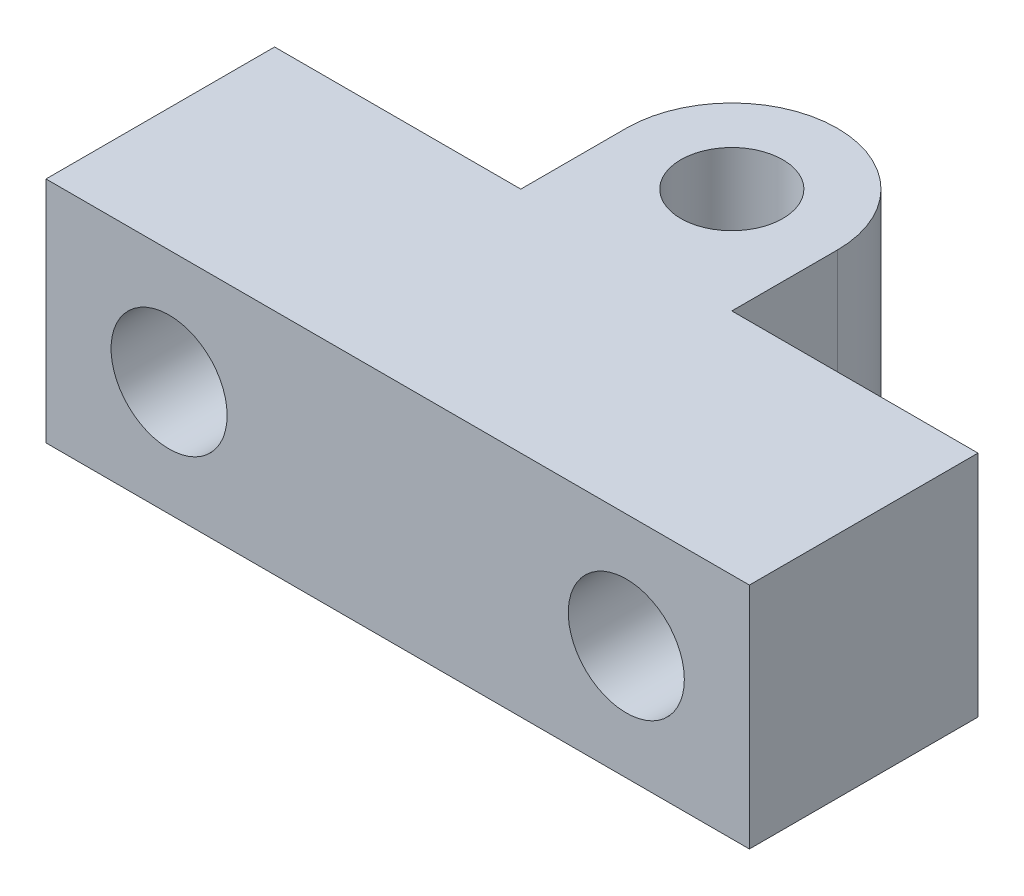
ISO-10303-21;
HEADER;
FILE_DESCRIPTION(('STEP AP214'),'2;1');
FILE_NAME('part.step','',(''),(''),'','','');
FILE_SCHEMA(('AUTOMOTIVE_DESIGN { 1 0 10303 214 1 1 1 1 }'));
ENDSEC;
DATA;
#1=APPLICATION_CONTEXT('core data for automotive mechanical design processes');
#2=APPLICATION_PROTOCOL_DEFINITION('international standard','automotive_design',2000,#1);
#3=PRODUCT_CONTEXT('',#1,'mechanical');
#4=PRODUCT('Part','Part','',(#3));
#5=PRODUCT_RELATED_PRODUCT_CATEGORY('part','',(#4));
#6=PRODUCT_DEFINITION_FORMATION('','',#4);
#7=PRODUCT_DEFINITION_CONTEXT('part definition',#1,'design');
#8=PRODUCT_DEFINITION('design','',#6,#7);
#9=PRODUCT_DEFINITION_SHAPE('','',#8);
#10=(LENGTH_UNIT() NAMED_UNIT(*) SI_UNIT(.MILLI.,.METRE.));
#11=(NAMED_UNIT(*) PLANE_ANGLE_UNIT() SI_UNIT($,.RADIAN.));
#12=(NAMED_UNIT(*) SI_UNIT($,.STERADIAN.) SOLID_ANGLE_UNIT());
#13=UNCERTAINTY_MEASURE_WITH_UNIT(LENGTH_MEASURE(1.E-05),#10,'distance_accuracy_value','');
#14=(GEOMETRIC_REPRESENTATION_CONTEXT(3) GLOBAL_UNCERTAINTY_ASSIGNED_CONTEXT((#13)) GLOBAL_UNIT_ASSIGNED_CONTEXT((#10,
#11,#12)) REPRESENTATION_CONTEXT('',''));
#15=CARTESIAN_POINT('',(0.,0.,0.));
#16=DIRECTION('',(0.,0.,1.));
#17=DIRECTION('',(1.,0.,0.));
#18=AXIS2_PLACEMENT_3D('',#15,#16,#17);
#19=CARTESIAN_POINT('',(0.,-3.25,0.));
#20=DIRECTION('',(0.,1.,0.));
#21=DIRECTION('',(1.,0.,0.));
#22=AXIS2_PLACEMENT_3D('',#19,#20,#21);
#23=PLANE('',#22);
#24=DIRECTION('',(-1.,0.,0.));
#25=VECTOR('',#24,1.);
#26=CARTESIAN_POINT('',(-3.,-3.25,3.));
#27=LINE('',#26,#25);
#28=CARTESIAN_POINT('',(-3.,-3.25,3.));
#29=VERTEX_POINT('',#28);
#30=CARTESIAN_POINT('',(-10.,-3.25,3.));
#31=VERTEX_POINT('',#30);
#32=EDGE_CURVE('E132',#29,#31,#27,.T.);
#33=ORIENTED_EDGE('',*,*,#32,.F.);
#34=DIRECTION('',(0.,0.,1.));
#35=VECTOR('',#34,1.);
#36=CARTESIAN_POINT('',(-3.,-3.25,0.));
#37=LINE('',#36,#35);
#38=CARTESIAN_POINT('',(-3.,-3.25,0.));
#39=VERTEX_POINT('',#38);
#40=EDGE_CURVE('E36',#39,#29,#37,.T.);
#41=ORIENTED_EDGE('',*,*,#40,.F.);
#42=CARTESIAN_POINT('',(0.,-3.25,0.));
#43=DIRECTION('',(0.,1.,0.));
#44=DIRECTION('',(1.,0.,0.));
#45=AXIS2_PLACEMENT_3D('',#42,#43,#44);
#46=CIRCLE('',#45,3.);
#47=CARTESIAN_POINT('',(3.,-3.25,0.));
#48=VERTEX_POINT('',#47);
#49=EDGE_CURVE('E146',#48,#39,#46,.T.);
#50=ORIENTED_EDGE('',*,*,#49,.F.);
#51=DIRECTION('',(0.,0.,-1.));
#52=VECTOR('',#51,1.);
#53=CARTESIAN_POINT('',(3.,-3.25,3.));
#54=LINE('',#53,#52);
#55=CARTESIAN_POINT('',(3.,-3.25,3.));
#56=VERTEX_POINT('',#55);
#57=EDGE_CURVE('E153',#56,#48,#54,.T.);
#58=ORIENTED_EDGE('',*,*,#57,.F.);
#59=DIRECTION('',(-1.,0.,0.));
#60=VECTOR('',#59,1.);
#61=CARTESIAN_POINT('',(10.,-3.25,3.));
#62=LINE('',#61,#60);
#63=CARTESIAN_POINT('',(10.,-3.25,3.));
#64=VERTEX_POINT('',#63);
#65=EDGE_CURVE('E158',#64,#56,#62,.T.);
#66=ORIENTED_EDGE('',*,*,#65,.F.);
#67=DIRECTION('',(0.,0.,-1.));
#68=VECTOR('',#67,1.);
#69=CARTESIAN_POINT('',(10.,-3.25,9.5));
#70=LINE('',#69,#68);
#71=CARTESIAN_POINT('',(10.,-3.25,9.5));
#72=VERTEX_POINT('',#71);
#73=EDGE_CURVE('E104',#72,#64,#70,.T.);
#74=ORIENTED_EDGE('',*,*,#73,.F.);
#75=DIRECTION('',(1.,0.,0.));
#76=VECTOR('',#75,1.);
#77=CARTESIAN_POINT('',(-10.,-3.25,9.5));
#78=LINE('',#77,#76);
#79=CARTESIAN_POINT('',(-10.,-3.25,9.5));
#80=VERTEX_POINT('',#79);
#81=EDGE_CURVE('E102',#80,#72,#78,.T.);
#82=ORIENTED_EDGE('',*,*,#81,.F.);
#83=DIRECTION('',(0.,0.,1.));
#84=VECTOR('',#83,1.);
#85=CARTESIAN_POINT('',(-10.,-3.25,3.));
#86=LINE('',#85,#84);
#87=EDGE_CURVE('E27',#31,#80,#86,.T.);
#88=ORIENTED_EDGE('',*,*,#87,.F.);
#89=EDGE_LOOP('',(#33,#41,#50,#58,#66,#74,#82,#88));
#90=FACE_BOUND('',#89,.T.);
#91=CARTESIAN_POINT('',(0.,-3.25,0.));
#92=DIRECTION('',(0.,-1.,0.));
#93=DIRECTION('',(-1.,0.,0.));
#94=AXIS2_PLACEMENT_3D('',#91,#92,#93);
#95=CIRCLE('',#94,1.45);
#96=CARTESIAN_POINT('',(-1.45,-3.25,0.));
#97=VERTEX_POINT('',#96);
#98=EDGE_CURVE('E124',#97,#97,#95,.T.);
#99=ORIENTED_EDGE('',*,*,#98,.F.);
#100=EDGE_LOOP('',(#99));
#101=FACE_BOUND('',#100,.T.);
#102=ADVANCED_FACE('F17',(#90,#101),#23,.F.);
#103=CARTESIAN_POINT('',(-10.,-3.25,3.));
#104=DIRECTION('',(-1.,0.,0.));
#105=DIRECTION('',(0.,0.,1.));
#106=AXIS2_PLACEMENT_3D('',#103,#104,#105);
#107=PLANE('',#106);
#108=DIRECTION('',(0.,1.,0.));
#109=VECTOR('',#108,1.);
#110=CARTESIAN_POINT('',(-10.,-3.25,9.5));
#111=LINE('',#110,#109);
#112=CARTESIAN_POINT('',(-10.,3.25,9.5));
#113=VERTEX_POINT('',#112);
#114=EDGE_CURVE('E11',#80,#113,#111,.T.);
#115=ORIENTED_EDGE('',*,*,#114,.T.);
#116=DIRECTION('',(0.,0.,1.));
#117=VECTOR('',#116,1.);
#118=CARTESIAN_POINT('',(-10.,3.25,3.));
#119=LINE('',#118,#117);
#120=CARTESIAN_POINT('',(-10.,3.25,3.));
#121=VERTEX_POINT('',#120);
#122=EDGE_CURVE('E109',#121,#113,#119,.T.);
#123=ORIENTED_EDGE('',*,*,#122,.F.);
#124=DIRECTION('',(0.,1.,0.));
#125=VECTOR('',#124,1.);
#126=CARTESIAN_POINT('',(-10.,-3.25,3.));
#127=LINE('',#126,#125);
#128=EDGE_CURVE('E123',#31,#121,#127,.T.);
#129=ORIENTED_EDGE('',*,*,#128,.F.);
#130=ORIENTED_EDGE('',*,*,#87,.T.);
#131=EDGE_LOOP('',(#115,#123,#129,#130));
#132=FACE_BOUND('',#131,.T.);
#133=ADVANCED_FACE('F181',(#132),#107,.T.);
#134=CARTESIAN_POINT('',(-3.,-3.25,3.));
#135=DIRECTION('',(0.,0.,-1.));
#136=DIRECTION('',(-1.,0.,0.));
#137=AXIS2_PLACEMENT_3D('',#134,#135,#136);
#138=PLANE('',#137);
#139=ORIENTED_EDGE('',*,*,#128,.T.);
#140=DIRECTION('',(-1.,0.,0.));
#141=VECTOR('',#140,1.);
#142=CARTESIAN_POINT('',(-3.,3.25,3.));
#143=LINE('',#142,#141);
#144=CARTESIAN_POINT('',(-3.,3.25,3.));
#145=VERTEX_POINT('',#144);
#146=EDGE_CURVE('E129',#145,#121,#143,.T.);
#147=ORIENTED_EDGE('',*,*,#146,.F.);
#148=DIRECTION('',(0.,1.,0.));
#149=VECTOR('',#148,1.);
#150=CARTESIAN_POINT('',(-3.,-3.25,3.));
#151=LINE('',#150,#149);
#152=EDGE_CURVE('E135',#29,#145,#151,.T.);
#153=ORIENTED_EDGE('',*,*,#152,.F.);
#154=ORIENTED_EDGE('',*,*,#32,.T.);
#155=EDGE_LOOP('',(#139,#147,#153,#154));
#156=FACE_BOUND('',#155,.T.);
#157=CARTESIAN_POINT('',(-6.5,0.,3.));
#158=DIRECTION('',(0.,0.,-1.));
#159=DIRECTION('',(1.,0.,0.));
#160=AXIS2_PLACEMENT_3D('',#157,#158,#159);
#161=CIRCLE('',#160,1.65);
#162=CARTESIAN_POINT('',(-4.85,0.,3.));
#163=VERTEX_POINT('',#162);
#164=EDGE_CURVE('E137',#163,#163,#161,.T.);
#165=ORIENTED_EDGE('',*,*,#164,.F.);
#166=EDGE_LOOP('',(#165));
#167=FACE_BOUND('',#166,.T.);
#168=ADVANCED_FACE('F187',(#156,#167),#138,.T.);
#169=CARTESIAN_POINT('',(-3.,-3.25,0.));
#170=DIRECTION('',(-1.,0.,0.));
#171=DIRECTION('',(0.,0.,1.));
#172=AXIS2_PLACEMENT_3D('',#169,#170,#171);
#173=PLANE('',#172);
#174=ORIENTED_EDGE('',*,*,#152,.T.);
#175=DIRECTION('',(0.,0.,1.));
#176=VECTOR('',#175,1.);
#177=CARTESIAN_POINT('',(-3.,3.25,0.));
#178=LINE('',#177,#176);
#179=CARTESIAN_POINT('',(-3.,3.25,0.));
#180=VERTEX_POINT('',#179);
#181=EDGE_CURVE('E134',#180,#145,#178,.T.);
#182=ORIENTED_EDGE('',*,*,#181,.F.);
#183=DIRECTION('',(0.,1.,0.));
#184=VECTOR('',#183,1.);
#185=CARTESIAN_POINT('',(-3.,-3.25,0.));
#186=LINE('',#185,#184);
#187=EDGE_CURVE('E143',#39,#180,#186,.T.);
#188=ORIENTED_EDGE('',*,*,#187,.F.);
#189=ORIENTED_EDGE('',*,*,#40,.T.);
#190=EDGE_LOOP('',(#174,#182,#188,#189));
#191=FACE_BOUND('',#190,.T.);
#192=ADVANCED_FACE('F194',(#191),#173,.T.);
#193=CARTESIAN_POINT('',(0.,-3.25,0.));
#194=DIRECTION('',(0.,1.,0.));
#195=DIRECTION('',(1.,0.,0.));
#196=AXIS2_PLACEMENT_3D('',#193,#194,#195);
#197=CYLINDRICAL_SURFACE('',#196,3.);
#198=ORIENTED_EDGE('',*,*,#187,.T.);
#199=CARTESIAN_POINT('',(0.,3.25,0.));
#200=DIRECTION('',(0.,1.,0.));
#201=DIRECTION('',(1.,0.,0.));
#202=AXIS2_PLACEMENT_3D('',#199,#200,#201);
#203=CIRCLE('',#202,3.);
#204=CARTESIAN_POINT('',(3.,3.25,0.));
#205=VERTEX_POINT('',#204);
#206=EDGE_CURVE('E142',#205,#180,#203,.T.);
#207=ORIENTED_EDGE('',*,*,#206,.F.);
#208=DIRECTION('',(0.,1.,0.));
#209=VECTOR('',#208,1.);
#210=CARTESIAN_POINT('',(3.,-3.25,0.));
#211=LINE('',#210,#209);
#212=EDGE_CURVE('E150',#48,#205,#211,.T.);
#213=ORIENTED_EDGE('',*,*,#212,.F.);
#214=ORIENTED_EDGE('',*,*,#49,.T.);
#215=EDGE_LOOP('',(#198,#207,#213,#214));
#216=FACE_BOUND('',#215,.T.);
#217=ADVANCED_FACE('F177',(#216),#197,.T.);
#218=CARTESIAN_POINT('',(3.,-3.25,3.));
#219=DIRECTION('',(1.,0.,0.));
#220=DIRECTION('',(0.,0.,-1.));
#221=AXIS2_PLACEMENT_3D('',#218,#219,#220);
#222=PLANE('',#221);
#223=ORIENTED_EDGE('',*,*,#212,.T.);
#224=DIRECTION('',(0.,0.,-1.));
#225=VECTOR('',#224,1.);
#226=CARTESIAN_POINT('',(3.,3.25,3.));
#227=LINE('',#226,#225);
#228=CARTESIAN_POINT('',(3.,3.25,3.));
#229=VERTEX_POINT('',#228);
#230=EDGE_CURVE('E149',#229,#205,#227,.T.);
#231=ORIENTED_EDGE('',*,*,#230,.F.);
#232=DIRECTION('',(0.,1.,0.));
#233=VECTOR('',#232,1.);
#234=CARTESIAN_POINT('',(3.,-3.25,3.));
#235=LINE('',#234,#233);
#236=EDGE_CURVE('E156',#56,#229,#235,.T.);
#237=ORIENTED_EDGE('',*,*,#236,.F.);
#238=ORIENTED_EDGE('',*,*,#57,.T.);
#239=EDGE_LOOP('',(#223,#231,#237,#238));
#240=FACE_BOUND('',#239,.T.);
#241=ADVANCED_FACE('F169',(#240),#222,.T.);
#242=CARTESIAN_POINT('',(10.,-3.25,3.));
#243=DIRECTION('',(0.,0.,-1.));
#244=DIRECTION('',(-1.,0.,0.));
#245=AXIS2_PLACEMENT_3D('',#242,#243,#244);
#246=PLANE('',#245);
#247=ORIENTED_EDGE('',*,*,#236,.T.);
#248=DIRECTION('',(-1.,0.,0.));
#249=VECTOR('',#248,1.);
#250=CARTESIAN_POINT('',(10.,3.25,3.));
#251=LINE('',#250,#249);
#252=CARTESIAN_POINT('',(10.,3.25,3.));
#253=VERTEX_POINT('',#252);
#254=EDGE_CURVE('E82',#253,#229,#251,.T.);
#255=ORIENTED_EDGE('',*,*,#254,.F.);
#256=DIRECTION('',(0.,1.,0.));
#257=VECTOR('',#256,1.);
#258=CARTESIAN_POINT('',(10.,-3.25,3.));
#259=LINE('',#258,#257);
#260=EDGE_CURVE('E92',#64,#253,#259,.T.);
#261=ORIENTED_EDGE('',*,*,#260,.F.);
#262=ORIENTED_EDGE('',*,*,#65,.T.);
#263=EDGE_LOOP('',(#247,#255,#261,#262));
#264=FACE_BOUND('',#263,.T.);
#265=CARTESIAN_POINT('',(6.5,0.,3.));
#266=DIRECTION('',(0.,0.,-1.));
#267=DIRECTION('',(1.,0.,0.));
#268=AXIS2_PLACEMENT_3D('',#265,#266,#267);
#269=CIRCLE('',#268,1.65);
#270=CARTESIAN_POINT('',(8.15,0.,3.));
#271=VERTEX_POINT('',#270);
#272=EDGE_CURVE('E126',#271,#271,#269,.T.);
#273=ORIENTED_EDGE('',*,*,#272,.F.);
#274=EDGE_LOOP('',(#273));
#275=FACE_BOUND('',#274,.T.);
#276=ADVANCED_FACE('F167',(#264,#275),#246,.T.);
#277=CARTESIAN_POINT('',(10.,-3.25,9.5));
#278=DIRECTION('',(1.,0.,0.));
#279=DIRECTION('',(0.,0.,-1.));
#280=AXIS2_PLACEMENT_3D('',#277,#278,#279);
#281=PLANE('',#280);
#282=ORIENTED_EDGE('',*,*,#260,.T.);
#283=DIRECTION('',(0.,0.,-1.));
#284=VECTOR('',#283,1.);
#285=CARTESIAN_POINT('',(10.,3.25,9.5));
#286=LINE('',#285,#284);
#287=CARTESIAN_POINT('',(10.,3.25,9.5));
#288=VERTEX_POINT('',#287);
#289=EDGE_CURVE('E88',#288,#253,#286,.T.);
#290=ORIENTED_EDGE('',*,*,#289,.F.);
#291=DIRECTION('',(0.,1.,0.));
#292=VECTOR('',#291,1.);
#293=CARTESIAN_POINT('',(10.,-3.25,9.5));
#294=LINE('',#293,#292);
#295=EDGE_CURVE('E91',#72,#288,#294,.T.);
#296=ORIENTED_EDGE('',*,*,#295,.F.);
#297=ORIENTED_EDGE('',*,*,#73,.T.);
#298=EDGE_LOOP('',(#282,#290,#296,#297));
#299=FACE_BOUND('',#298,.T.);
#300=ADVANCED_FACE('F90',(#299),#281,.T.);
#301=CARTESIAN_POINT('',(-10.,-3.25,9.5));
#302=DIRECTION('',(0.,0.,1.));
#303=DIRECTION('',(1.,0.,0.));
#304=AXIS2_PLACEMENT_3D('',#301,#302,#303);
#305=PLANE('',#304);
#306=ORIENTED_EDGE('',*,*,#295,.T.);
#307=DIRECTION('',(1.,0.,0.));
#308=VECTOR('',#307,1.);
#309=CARTESIAN_POINT('',(-10.,3.25,9.5));
#310=LINE('',#309,#308);
#311=EDGE_CURVE('E95',#113,#288,#310,.T.);
#312=ORIENTED_EDGE('',*,*,#311,.F.);
#313=ORIENTED_EDGE('',*,*,#114,.F.);
#314=ORIENTED_EDGE('',*,*,#81,.T.);
#315=EDGE_LOOP('',(#306,#312,#313,#314));
#316=FACE_BOUND('',#315,.T.);
#317=CARTESIAN_POINT('',(6.5,0.,9.5));
#318=DIRECTION('',(0.,0.,-1.));
#319=DIRECTION('',(1.,0.,0.));
#320=AXIS2_PLACEMENT_3D('',#317,#318,#319);
#321=CIRCLE('',#320,1.65);
#322=CARTESIAN_POINT('',(8.15,0.,9.5));
#323=VERTEX_POINT('',#322);
#324=EDGE_CURVE('E113',#323,#323,#321,.T.);
#325=ORIENTED_EDGE('',*,*,#324,.T.);
#326=EDGE_LOOP('',(#325));
#327=FACE_BOUND('',#326,.T.);
#328=CARTESIAN_POINT('',(-6.5,0.,9.5));
#329=DIRECTION('',(0.,0.,-1.));
#330=DIRECTION('',(1.,0.,0.));
#331=AXIS2_PLACEMENT_3D('',#328,#329,#330);
#332=CIRCLE('',#331,1.65);
#333=CARTESIAN_POINT('',(-4.85,0.,9.5));
#334=VERTEX_POINT('',#333);
#335=EDGE_CURVE('E110',#334,#334,#332,.T.);
#336=ORIENTED_EDGE('',*,*,#335,.T.);
#337=EDGE_LOOP('',(#336));
#338=FACE_BOUND('',#337,.T.);
#339=ADVANCED_FACE('F99',(#316,#327,#338),#305,.T.);
#340=CARTESIAN_POINT('',(0.,3.25,0.));
#341=DIRECTION('',(0.,1.,0.));
#342=DIRECTION('',(1.,0.,0.));
#343=AXIS2_PLACEMENT_3D('',#340,#341,#342);
#344=PLANE('',#343);
#345=ORIENTED_EDGE('',*,*,#311,.T.);
#346=ORIENTED_EDGE('',*,*,#289,.T.);
#347=ORIENTED_EDGE('',*,*,#254,.T.);
#348=ORIENTED_EDGE('',*,*,#230,.T.);
#349=ORIENTED_EDGE('',*,*,#206,.T.);
#350=ORIENTED_EDGE('',*,*,#181,.T.);
#351=ORIENTED_EDGE('',*,*,#146,.T.);
#352=ORIENTED_EDGE('',*,*,#122,.T.);
#353=EDGE_LOOP('',(#345,#346,#347,#348,#349,#350,#351,#352));
#354=FACE_BOUND('',#353,.T.);
#355=CARTESIAN_POINT('',(0.,3.25,0.));
#356=DIRECTION('',(0.,-1.,0.));
#357=DIRECTION('',(-1.,0.,0.));
#358=AXIS2_PLACEMENT_3D('',#355,#356,#357);
#359=CIRCLE('',#358,1.45);
#360=CARTESIAN_POINT('',(-1.45,3.25,0.));
#361=VERTEX_POINT('',#360);
#362=EDGE_CURVE('E21',#361,#361,#359,.T.);
#363=ORIENTED_EDGE('',*,*,#362,.T.);
#364=EDGE_LOOP('',(#363));
#365=FACE_BOUND('',#364,.T.);
#366=ADVANCED_FACE('F106',(#354,#365),#344,.T.);
#367=CARTESIAN_POINT('',(0.,3.25,0.));
#368=DIRECTION('',(0.,-1.,0.));
#369=DIRECTION('',(1.,0.,0.));
#370=AXIS2_PLACEMENT_3D('',#367,#368,#369);
#371=CYLINDRICAL_SURFACE('',#370,1.45);
#372=ORIENTED_EDGE('',*,*,#98,.T.);
#373=EDGE_LOOP('',(#372));
#374=FACE_BOUND('',#373,.T.);
#375=ORIENTED_EDGE('',*,*,#362,.F.);
#376=EDGE_LOOP('',(#375));
#377=FACE_BOUND('',#376,.T.);
#378=ADVANCED_FACE('F226',(#374,#377),#371,.F.);
#379=CARTESIAN_POINT('',(6.5,0.,9.5));
#380=DIRECTION('',(0.,0.,-1.));
#381=DIRECTION('',(-1.,0.,0.));
#382=AXIS2_PLACEMENT_3D('',#379,#380,#381);
#383=CYLINDRICAL_SURFACE('',#382,1.65);
#384=ORIENTED_EDGE('',*,*,#272,.T.);
#385=EDGE_LOOP('',(#384));
#386=FACE_BOUND('',#385,.T.);
#387=ORIENTED_EDGE('',*,*,#324,.F.);
#388=EDGE_LOOP('',(#387));
#389=FACE_BOUND('',#388,.T.);
#390=ADVANCED_FACE('F164',(#386,#389),#383,.F.);
#391=CARTESIAN_POINT('',(-6.5,0.,9.5));
#392=DIRECTION('',(0.,0.,-1.));
#393=DIRECTION('',(-1.,0.,0.));
#394=AXIS2_PLACEMENT_3D('',#391,#392,#393);
#395=CYLINDRICAL_SURFACE('',#394,1.65);
#396=ORIENTED_EDGE('',*,*,#164,.T.);
#397=EDGE_LOOP('',(#396));
#398=FACE_BOUND('',#397,.T.);
#399=ORIENTED_EDGE('',*,*,#335,.F.);
#400=EDGE_LOOP('',(#399));
#401=FACE_BOUND('',#400,.T.);
#402=ADVANCED_FACE('F19',(#398,#401),#395,.F.);
#403=CLOSED_SHELL('',(#102,#133,#168,#192,#217,#241,#276,#300,#339,#366,#378,#390,#402));
#404=MANIFOLD_SOLID_BREP('B1',#403);
#405=ADVANCED_BREP_SHAPE_REPRESENTATION('',(#18,#404),#14);
#406=SHAPE_DEFINITION_REPRESENTATION(#9,#405);
ENDSEC;
END-ISO-10303-21;
